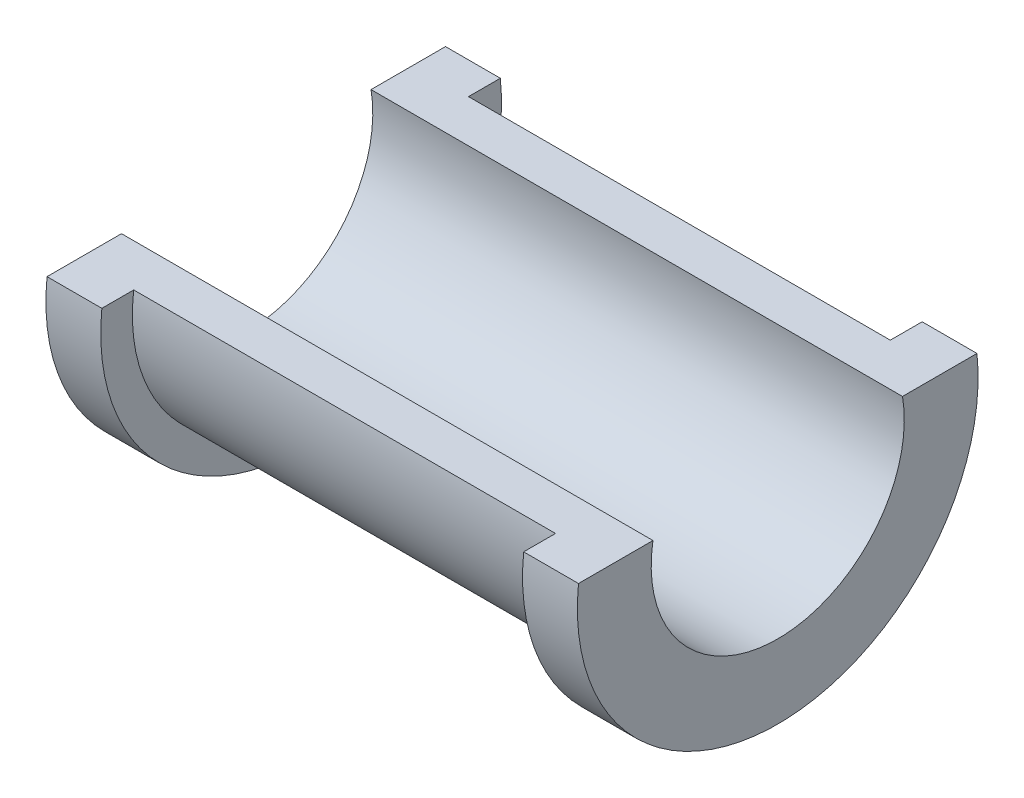
ISO-10303-21;
HEADER;
FILE_DESCRIPTION(('STEP AP214'),'2;1');
FILE_NAME('part.step','',(''),(''),'','','');
FILE_SCHEMA(('AUTOMOTIVE_DESIGN { 1 0 10303 214 1 1 1 1 }'));
ENDSEC;
DATA;
#1=APPLICATION_CONTEXT('core data for automotive mechanical design processes');
#2=APPLICATION_PROTOCOL_DEFINITION('international standard','automotive_design',2000,#1);
#3=PRODUCT_CONTEXT('',#1,'mechanical');
#4=PRODUCT('Part','Part','',(#3));
#5=PRODUCT_RELATED_PRODUCT_CATEGORY('part','',(#4));
#6=PRODUCT_DEFINITION_FORMATION('','',#4);
#7=PRODUCT_DEFINITION_CONTEXT('part definition',#1,'design');
#8=PRODUCT_DEFINITION('design','',#6,#7);
#9=PRODUCT_DEFINITION_SHAPE('','',#8);
#10=(LENGTH_UNIT() NAMED_UNIT(*) SI_UNIT(.MILLI.,.METRE.));
#11=(NAMED_UNIT(*) PLANE_ANGLE_UNIT() SI_UNIT($,.RADIAN.));
#12=(NAMED_UNIT(*) SI_UNIT($,.STERADIAN.) SOLID_ANGLE_UNIT());
#13=UNCERTAINTY_MEASURE_WITH_UNIT(LENGTH_MEASURE(1.E-05),#10,'distance_accuracy_value','');
#14=(GEOMETRIC_REPRESENTATION_CONTEXT(3) GLOBAL_UNCERTAINTY_ASSIGNED_CONTEXT((#13)) GLOBAL_UNIT_ASSIGNED_CONTEXT((#10,
#11,#12)) REPRESENTATION_CONTEXT('',''));
#15=CARTESIAN_POINT('',(0.,0.,0.));
#16=DIRECTION('',(0.,0.,1.));
#17=DIRECTION('',(1.,0.,0.));
#18=AXIS2_PLACEMENT_3D('',#15,#16,#17);
#19=CARTESIAN_POINT('',(-261.737648962979,5.,62.0854816400069));
#20=DIRECTION('',(0.,-1.,0.));
#21=DIRECTION('',(0.,0.,-1.));
#22=AXIS2_PLACEMENT_3D('',#19,#20,#21);
#23=PLANE('',#22);
#24=DIRECTION('',(1.,0.,0.));
#25=VECTOR('',#24,1.);
#26=CARTESIAN_POINT('',(126.,5.,-47.236109069228));
#27=LINE('',#26,#25);
#28=CARTESIAN_POINT('',(13.,5.,-47.236109069228));
#29=VERTEX_POINT('',#28);
#30=CARTESIAN_POINT('',(0.,5.,-47.236109069228));
#31=VERTEX_POINT('',#30);
#32=EDGE_CURVE('E134',#29,#31,#27,.F.);
#33=ORIENTED_EDGE('',*,*,#32,.T.);
#34=DIRECTION('',(0.,0.,1.));
#35=VECTOR('',#34,1.);
#36=CARTESIAN_POINT('',(0.,5.,0.));
#37=LINE('',#36,#35);
#38=CARTESIAN_POINT('',(0.,5.,-29.5803989154981));
#39=VERTEX_POINT('',#38);
#40=EDGE_CURVE('E65',#31,#39,#37,.T.);
#41=ORIENTED_EDGE('',*,*,#40,.T.);
#42=DIRECTION('',(1.,0.,0.));
#43=VECTOR('',#42,1.);
#44=CARTESIAN_POINT('',(0.,5.,-29.5803989154981));
#45=LINE('',#44,#43);
#46=CARTESIAN_POINT('',(126.,5.,-29.5803989154981));
#47=VERTEX_POINT('',#46);
#48=EDGE_CURVE('E11',#47,#39,#45,.F.);
#49=ORIENTED_EDGE('',*,*,#48,.F.);
#50=DIRECTION('',(0.,0.,-1.));
#51=VECTOR('',#50,1.);
#52=CARTESIAN_POINT('',(126.,5.,0.));
#53=LINE('',#52,#51);
#54=CARTESIAN_POINT('',(126.,5.,-47.236109069228));
#55=VERTEX_POINT('',#54);
#56=EDGE_CURVE('E119',#47,#55,#53,.T.);
#57=ORIENTED_EDGE('',*,*,#56,.T.);
#58=DIRECTION('',(1.,0.,0.));
#59=VECTOR('',#58,1.);
#60=CARTESIAN_POINT('',(126.,5.,-47.236109069228));
#61=LINE('',#60,#59);
#62=CARTESIAN_POINT('',(113.,5.,-47.236109069228));
#63=VERTEX_POINT('',#62);
#64=EDGE_CURVE('E167',#55,#63,#61,.F.);
#65=ORIENTED_EDGE('',*,*,#64,.T.);
#66=DIRECTION('',(0.,0.,1.));
#67=VECTOR('',#66,1.);
#68=CARTESIAN_POINT('',(113.,5.,0.));
#69=LINE('',#68,#67);
#70=CARTESIAN_POINT('',(113.,5.,-39.6862696659689));
#71=VERTEX_POINT('',#70);
#72=EDGE_CURVE('E169',#63,#71,#69,.T.);
#73=ORIENTED_EDGE('',*,*,#72,.T.);
#74=DIRECTION('',(1.,0.,0.));
#75=VECTOR('',#74,1.);
#76=CARTESIAN_POINT('',(126.,5.,-39.6862696659689));
#77=LINE('',#76,#75);
#78=CARTESIAN_POINT('',(13.,5.,-39.6862696659689));
#79=VERTEX_POINT('',#78);
#80=EDGE_CURVE('E170',#71,#79,#77,.F.);
#81=ORIENTED_EDGE('',*,*,#80,.T.);
#82=DIRECTION('',(0.,0.,-1.));
#83=VECTOR('',#82,1.);
#84=CARTESIAN_POINT('',(13.,5.,0.));
#85=LINE('',#84,#83);
#86=EDGE_CURVE('E164',#79,#29,#85,.T.);
#87=ORIENTED_EDGE('',*,*,#86,.T.);
#88=EDGE_LOOP('',(#33,#41,#49,#57,#65,#73,#81,#87));
#89=FACE_BOUND('',#88,.T.);
#90=ADVANCED_FACE('F41',(#89),#23,.F.);
#91=CARTESIAN_POINT('',(0.,0.,0.));
#92=DIRECTION('',(-1.,0.,0.));
#93=DIRECTION('',(0.,0.,1.));
#94=AXIS2_PLACEMENT_3D('',#91,#92,#93);
#95=PLANE('',#94);
#96=ORIENTED_EDGE('',*,*,#40,.F.);
#97=CARTESIAN_POINT('',(0.,0.,0.));
#98=DIRECTION('',(1.,0.,0.));
#99=DIRECTION('',(0.,0.,-1.));
#100=AXIS2_PLACEMENT_3D('',#97,#98,#99);
#101=CIRCLE('',#100,47.5);
#102=CARTESIAN_POINT('',(0.,5.,47.236109069228));
#103=VERTEX_POINT('',#102);
#104=EDGE_CURVE('E112',#103,#31,#101,.T.);
#105=ORIENTED_EDGE('',*,*,#104,.F.);
#106=CARTESIAN_POINT('',(0.,5.,29.5803989154981));
#107=VERTEX_POINT('',#106);
#108=EDGE_CURVE('E105',#107,#103,#37,.T.);
#109=ORIENTED_EDGE('',*,*,#108,.F.);
#110=CARTESIAN_POINT('',(0.,0.,0.));
#111=DIRECTION('',(1.,0.,0.));
#112=DIRECTION('',(0.,0.,-1.));
#113=AXIS2_PLACEMENT_3D('',#110,#111,#112);
#114=CIRCLE('',#113,30.);
#115=EDGE_CURVE('E116',#107,#39,#114,.T.);
#116=ORIENTED_EDGE('',*,*,#115,.T.);
#117=EDGE_LOOP('',(#96,#105,#109,#116));
#118=FACE_BOUND('',#117,.T.);
#119=ADVANCED_FACE('F43',(#118),#95,.T.);
#120=CARTESIAN_POINT('',(126.,0.,0.));
#121=DIRECTION('',(1.,0.,0.));
#122=DIRECTION('',(0.,0.,-1.));
#123=AXIS2_PLACEMENT_3D('',#120,#121,#122);
#124=CYLINDRICAL_SURFACE('',#123,47.5);
#125=ORIENTED_EDGE('',*,*,#32,.F.);
#126=CARTESIAN_POINT('',(13.,0.,0.));
#127=DIRECTION('',(1.,0.,0.));
#128=DIRECTION('',(0.,0.,-1.));
#129=AXIS2_PLACEMENT_3D('',#126,#127,#128);
#130=CIRCLE('',#129,47.5);
#131=CARTESIAN_POINT('',(13.,5.,47.236109069228));
#132=VERTEX_POINT('',#131);
#133=EDGE_CURVE('E148',#132,#29,#130,.T.);
#134=ORIENTED_EDGE('',*,*,#133,.F.);
#135=DIRECTION('',(1.,0.,0.));
#136=VECTOR('',#135,1.);
#137=CARTESIAN_POINT('',(126.,5.,47.236109069228));
#138=LINE('',#137,#136);
#139=EDGE_CURVE('E120',#103,#132,#138,.T.);
#140=ORIENTED_EDGE('',*,*,#139,.F.);
#141=ORIENTED_EDGE('',*,*,#104,.T.);
#142=EDGE_LOOP('',(#125,#134,#140,#141));
#143=FACE_BOUND('',#142,.T.);
#144=ADVANCED_FACE('F155',(#143),#124,.T.);
#145=CARTESIAN_POINT('',(13.,47.5,0.));
#146=DIRECTION('',(1.,0.,0.));
#147=DIRECTION('',(0.,0.,-1.));
#148=AXIS2_PLACEMENT_3D('',#145,#146,#147);
#149=PLANE('',#148);
#150=CARTESIAN_POINT('',(13.,5.,39.6862696659689));
#151=VERTEX_POINT('',#150);
#152=EDGE_CURVE('E159',#132,#151,#85,.T.);
#153=ORIENTED_EDGE('',*,*,#152,.F.);
#154=ORIENTED_EDGE('',*,*,#133,.T.);
#155=ORIENTED_EDGE('',*,*,#86,.F.);
#156=CARTESIAN_POINT('',(13.,0.,0.));
#157=DIRECTION('',(1.,0.,0.));
#158=DIRECTION('',(0.,0.,-1.));
#159=AXIS2_PLACEMENT_3D('',#156,#157,#158);
#160=CIRCLE('',#159,40.);
#161=EDGE_CURVE('E144',#151,#79,#160,.T.);
#162=ORIENTED_EDGE('',*,*,#161,.F.);
#163=EDGE_LOOP('',(#153,#154,#155,#162));
#164=FACE_BOUND('',#163,.T.);
#165=ADVANCED_FACE('F248',(#164),#149,.T.);
#166=CARTESIAN_POINT('',(126.,0.,0.));
#167=DIRECTION('',(1.,0.,0.));
#168=DIRECTION('',(0.,0.,-1.));
#169=AXIS2_PLACEMENT_3D('',#166,#167,#168);
#170=CYLINDRICAL_SURFACE('',#169,40.);
#171=ORIENTED_EDGE('',*,*,#80,.F.);
#172=CARTESIAN_POINT('',(113.,0.,0.));
#173=DIRECTION('',(1.,0.,0.));
#174=DIRECTION('',(0.,0.,-1.));
#175=AXIS2_PLACEMENT_3D('',#172,#173,#174);
#176=CIRCLE('',#175,40.);
#177=CARTESIAN_POINT('',(113.,5.,39.6862696659689));
#178=VERTEX_POINT('',#177);
#179=EDGE_CURVE('E140',#178,#71,#176,.T.);
#180=ORIENTED_EDGE('',*,*,#179,.F.);
#181=DIRECTION('',(1.,0.,0.));
#182=VECTOR('',#181,1.);
#183=CARTESIAN_POINT('',(126.,5.,39.6862696659689));
#184=LINE('',#183,#182);
#185=EDGE_CURVE('E162',#151,#178,#184,.T.);
#186=ORIENTED_EDGE('',*,*,#185,.F.);
#187=ORIENTED_EDGE('',*,*,#161,.T.);
#188=EDGE_LOOP('',(#171,#180,#186,#187));
#189=FACE_BOUND('',#188,.T.);
#190=ADVANCED_FACE('F238',(#189),#170,.T.);
#191=CARTESIAN_POINT('',(113.,40.,0.));
#192=DIRECTION('',(-1.,0.,0.));
#193=DIRECTION('',(0.,0.,1.));
#194=AXIS2_PLACEMENT_3D('',#191,#192,#193);
#195=PLANE('',#194);
#196=ORIENTED_EDGE('',*,*,#72,.F.);
#197=CARTESIAN_POINT('',(113.,0.,0.));
#198=DIRECTION('',(1.,0.,0.));
#199=DIRECTION('',(0.,0.,-1.));
#200=AXIS2_PLACEMENT_3D('',#197,#198,#199);
#201=CIRCLE('',#200,47.5);
#202=CARTESIAN_POINT('',(113.,5.,47.236109069228));
#203=VERTEX_POINT('',#202);
#204=EDGE_CURVE('E130',#203,#63,#201,.T.);
#205=ORIENTED_EDGE('',*,*,#204,.F.);
#206=EDGE_CURVE('E177',#178,#203,#69,.T.);
#207=ORIENTED_EDGE('',*,*,#206,.F.);
#208=ORIENTED_EDGE('',*,*,#179,.T.);
#209=EDGE_LOOP('',(#196,#205,#207,#208));
#210=FACE_BOUND('',#209,.T.);
#211=ADVANCED_FACE('F204',(#210),#195,.T.);
#212=CARTESIAN_POINT('',(126.,0.,0.));
#213=DIRECTION('',(1.,0.,0.));
#214=DIRECTION('',(0.,0.,-1.));
#215=AXIS2_PLACEMENT_3D('',#212,#213,#214);
#216=CYLINDRICAL_SURFACE('',#215,47.5);
#217=ORIENTED_EDGE('',*,*,#64,.F.);
#218=CARTESIAN_POINT('',(126.,0.,0.));
#219=DIRECTION('',(1.,0.,0.));
#220=DIRECTION('',(0.,0.,-1.));
#221=AXIS2_PLACEMENT_3D('',#218,#219,#220);
#222=CIRCLE('',#221,47.5);
#223=CARTESIAN_POINT('',(126.,5.,47.236109069228));
#224=VERTEX_POINT('',#223);
#225=EDGE_CURVE('E124',#224,#55,#222,.T.);
#226=ORIENTED_EDGE('',*,*,#225,.F.);
#227=DIRECTION('',(1.,0.,0.));
#228=VECTOR('',#227,1.);
#229=CARTESIAN_POINT('',(126.,5.,47.236109069228));
#230=LINE('',#229,#228);
#231=EDGE_CURVE('E181',#203,#224,#230,.T.);
#232=ORIENTED_EDGE('',*,*,#231,.F.);
#233=ORIENTED_EDGE('',*,*,#204,.T.);
#234=EDGE_LOOP('',(#217,#226,#232,#233));
#235=FACE_BOUND('',#234,.T.);
#236=ADVANCED_FACE('F194',(#235),#216,.T.);
#237=CARTESIAN_POINT('',(126.,47.5,0.));
#238=DIRECTION('',(1.,0.,0.));
#239=DIRECTION('',(0.,0.,-1.));
#240=AXIS2_PLACEMENT_3D('',#237,#238,#239);
#241=PLANE('',#240);
#242=CARTESIAN_POINT('',(126.,5.,29.5803989154981));
#243=VERTEX_POINT('',#242);
#244=EDGE_CURVE('E57',#224,#243,#53,.T.);
#245=ORIENTED_EDGE('',*,*,#244,.F.);
#246=ORIENTED_EDGE('',*,*,#225,.T.);
#247=ORIENTED_EDGE('',*,*,#56,.F.);
#248=CARTESIAN_POINT('',(126.,0.,0.));
#249=DIRECTION('',(1.,0.,0.));
#250=DIRECTION('',(0.,0.,-1.));
#251=AXIS2_PLACEMENT_3D('',#248,#249,#250);
#252=CIRCLE('',#251,30.);
#253=EDGE_CURVE('E125',#243,#47,#252,.T.);
#254=ORIENTED_EDGE('',*,*,#253,.F.);
#255=EDGE_LOOP('',(#245,#246,#247,#254));
#256=FACE_BOUND('',#255,.T.);
#257=ADVANCED_FACE('F196',(#256),#241,.T.);
#258=CARTESIAN_POINT('',(0.,0.,0.));
#259=DIRECTION('',(1.,0.,0.));
#260=DIRECTION('',(0.,0.,-1.));
#261=AXIS2_PLACEMENT_3D('',#258,#259,#260);
#262=CYLINDRICAL_SURFACE('',#261,30.);
#263=ORIENTED_EDGE('',*,*,#253,.T.);
#264=ORIENTED_EDGE('',*,*,#48,.T.);
#265=ORIENTED_EDGE('',*,*,#115,.F.);
#266=DIRECTION('',(1.,0.,0.));
#267=VECTOR('',#266,1.);
#268=CARTESIAN_POINT('',(0.,5.,29.5803989154981));
#269=LINE('',#268,#267);
#270=EDGE_CURVE('E50',#107,#243,#269,.T.);
#271=ORIENTED_EDGE('',*,*,#270,.T.);
#272=EDGE_LOOP('',(#263,#264,#265,#271));
#273=FACE_BOUND('',#272,.T.);
#274=ADVANCED_FACE('F122',(#273),#262,.F.);
#275=ORIENTED_EDGE('',*,*,#270,.F.);
#276=ORIENTED_EDGE('',*,*,#108,.T.);
#277=ORIENTED_EDGE('',*,*,#139,.T.);
#278=ORIENTED_EDGE('',*,*,#152,.T.);
#279=ORIENTED_EDGE('',*,*,#185,.T.);
#280=ORIENTED_EDGE('',*,*,#206,.T.);
#281=ORIENTED_EDGE('',*,*,#231,.T.);
#282=ORIENTED_EDGE('',*,*,#244,.T.);
#283=EDGE_LOOP('',(#275,#276,#277,#278,#279,#280,#281,#282));
#284=FACE_BOUND('',#283,.T.);
#285=ADVANCED_FACE('F104',(#284),#23,.F.);
#286=CLOSED_SHELL('',(#90,#119,#144,#165,#190,#211,#236,#257,#274,#285));
#287=MANIFOLD_SOLID_BREP('B2',#286);
#288=ADVANCED_BREP_SHAPE_REPRESENTATION('',(#18,#287),#14);
#289=SHAPE_DEFINITION_REPRESENTATION(#9,#288);
ENDSEC;
END-ISO-10303-21;
